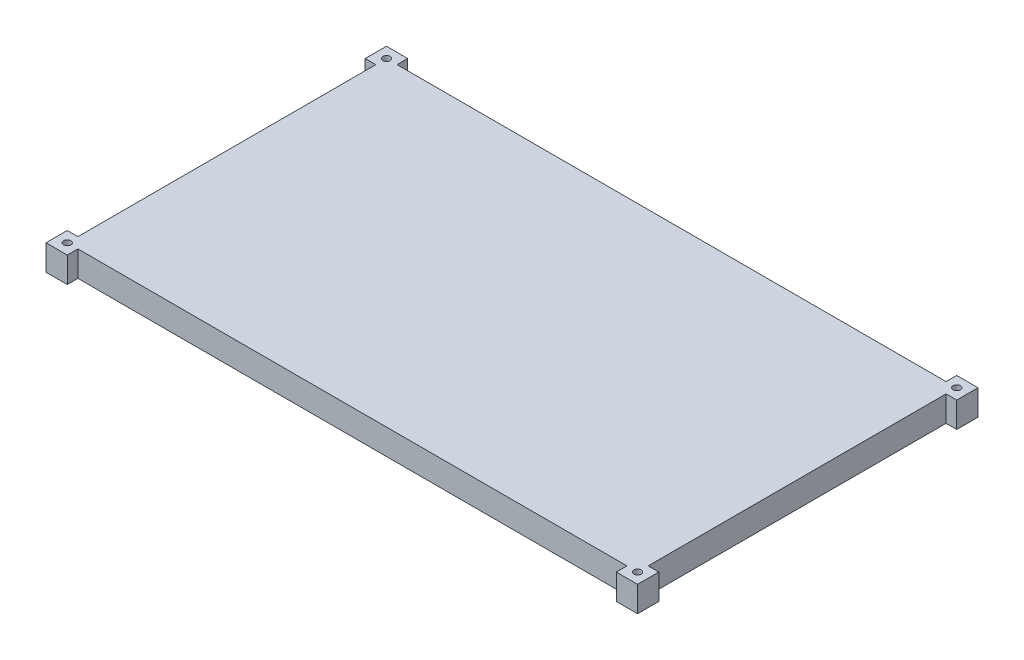
ISO-10303-21;
HEADER;
FILE_DESCRIPTION(('STEP AP214'),'2;1');
FILE_NAME('part.step','',(''),(''),'','','');
FILE_SCHEMA(('AUTOMOTIVE_DESIGN { 1 0 10303 214 1 1 1 1 }'));
ENDSEC;
DATA;
#1=APPLICATION_CONTEXT('core data for automotive mechanical design processes');
#2=APPLICATION_PROTOCOL_DEFINITION('international standard','automotive_design',2000,#1);
#3=PRODUCT_CONTEXT('',#1,'mechanical');
#4=PRODUCT('Part','Part','',(#3));
#5=PRODUCT_RELATED_PRODUCT_CATEGORY('part','',(#4));
#6=PRODUCT_DEFINITION_FORMATION('','',#4);
#7=PRODUCT_DEFINITION_CONTEXT('part definition',#1,'design');
#8=PRODUCT_DEFINITION('design','',#6,#7);
#9=PRODUCT_DEFINITION_SHAPE('','',#8);
#10=(LENGTH_UNIT() NAMED_UNIT(*) SI_UNIT(.MILLI.,.METRE.));
#11=(NAMED_UNIT(*) PLANE_ANGLE_UNIT() SI_UNIT($,.RADIAN.));
#12=(NAMED_UNIT(*) SI_UNIT($,.STERADIAN.) SOLID_ANGLE_UNIT());
#13=UNCERTAINTY_MEASURE_WITH_UNIT(LENGTH_MEASURE(1.E-05),#10,'distance_accuracy_value','');
#14=(GEOMETRIC_REPRESENTATION_CONTEXT(3) GLOBAL_UNCERTAINTY_ASSIGNED_CONTEXT((#13)) GLOBAL_UNIT_ASSIGNED_CONTEXT((#10,
#11,#12)) REPRESENTATION_CONTEXT('',''));
#15=CARTESIAN_POINT('',(0.,0.,0.));
#16=DIRECTION('',(0.,0.,1.));
#17=DIRECTION('',(1.,0.,0.));
#18=AXIS2_PLACEMENT_3D('',#15,#16,#17);
#19=CARTESIAN_POINT('',(85.09,7.62,47.625));
#20=DIRECTION('',(-1.,0.,0.));
#21=DIRECTION('',(0.,0.,1.));
#22=AXIS2_PLACEMENT_3D('',#19,#20,#21);
#23=PLANE('',#22);
#24=DIRECTION('',(0.,0.,-1.));
#25=VECTOR('',#24,1.);
#26=CARTESIAN_POINT('',(85.09,0.,47.625));
#27=LINE('',#26,#25);
#28=CARTESIAN_POINT('',(85.09,0.,44.45));
#29=VERTEX_POINT('',#28);
#30=CARTESIAN_POINT('',(85.09,0.,-44.45));
#31=VERTEX_POINT('',#30);
#32=EDGE_CURVE('E904',#29,#31,#27,.T.);
#33=ORIENTED_EDGE('',*,*,#32,.T.);
#34=DIRECTION('',(0.,1.,0.));
#35=VECTOR('',#34,1.);
#36=CARTESIAN_POINT('',(85.09,7.62,-44.45));
#37=LINE('',#36,#35);
#38=CARTESIAN_POINT('',(85.09,7.62,-44.45));
#39=VERTEX_POINT('',#38);
#40=EDGE_CURVE('E12',#31,#39,#37,.T.);
#41=ORIENTED_EDGE('',*,*,#40,.T.);
#42=DIRECTION('',(0.,0.,-1.));
#43=VECTOR('',#42,1.);
#44=CARTESIAN_POINT('',(85.09,7.62,47.625));
#45=LINE('',#44,#43);
#46=CARTESIAN_POINT('',(85.09,7.62,44.45));
#47=VERTEX_POINT('',#46);
#48=EDGE_CURVE('E908',#47,#39,#45,.T.);
#49=ORIENTED_EDGE('',*,*,#48,.F.);
#50=DIRECTION('',(0.,-1.,0.));
#51=VECTOR('',#50,1.);
#52=CARTESIAN_POINT('',(85.09,7.62,44.45));
#53=LINE('',#52,#51);
#54=EDGE_CURVE('E611',#47,#29,#53,.T.);
#55=ORIENTED_EDGE('',*,*,#54,.T.);
#56=EDGE_LOOP('',(#33,#41,#49,#55));
#57=FACE_BOUND('',#56,.T.);
#58=ADVANCED_FACE('F607',(#57),#23,.F.);
#59=CARTESIAN_POINT('',(-85.09,7.62,-47.625));
#60=DIRECTION('',(0.,0.,1.));
#61=DIRECTION('',(1.,0.,0.));
#62=AXIS2_PLACEMENT_3D('',#59,#60,#61);
#63=PLANE('',#62);
#64=DIRECTION('',(-1.,0.,0.));
#65=VECTOR('',#64,1.);
#66=CARTESIAN_POINT('',(-85.09,7.62,-47.625));
#67=LINE('',#66,#65);
#68=CARTESIAN_POINT('',(81.915,7.62,-47.625));
#69=VERTEX_POINT('',#68);
#70=CARTESIAN_POINT('',(-81.915,7.62,-47.625));
#71=VERTEX_POINT('',#70);
#72=EDGE_CURVE('E911',#69,#71,#67,.T.);
#73=ORIENTED_EDGE('',*,*,#72,.F.);
#74=DIRECTION('',(0.,-1.,0.));
#75=VECTOR('',#74,1.);
#76=CARTESIAN_POINT('',(81.915,7.62,-47.625));
#77=LINE('',#76,#75);
#78=CARTESIAN_POINT('',(81.915,0.,-47.625));
#79=VERTEX_POINT('',#78);
#80=EDGE_CURVE('E957',#69,#79,#77,.T.);
#81=ORIENTED_EDGE('',*,*,#80,.T.);
#82=DIRECTION('',(-1.,0.,0.));
#83=VECTOR('',#82,1.);
#84=CARTESIAN_POINT('',(-85.09,0.,-47.625));
#85=LINE('',#84,#83);
#86=CARTESIAN_POINT('',(-81.915,0.,-47.625));
#87=VERTEX_POINT('',#86);
#88=EDGE_CURVE('E927',#79,#87,#85,.T.);
#89=ORIENTED_EDGE('',*,*,#88,.T.);
#90=DIRECTION('',(0.,1.,0.));
#91=VECTOR('',#90,1.);
#92=CARTESIAN_POINT('',(-81.915,7.62,-47.625));
#93=LINE('',#92,#91);
#94=EDGE_CURVE('E954',#87,#71,#93,.T.);
#95=ORIENTED_EDGE('',*,*,#94,.T.);
#96=EDGE_LOOP('',(#73,#81,#89,#95));
#97=FACE_BOUND('',#96,.T.);
#98=ADVANCED_FACE('F1040',(#97),#63,.F.);
#99=CARTESIAN_POINT('',(-85.09,7.62,47.625));
#100=DIRECTION('',(1.,0.,0.));
#101=DIRECTION('',(0.,0.,-1.));
#102=AXIS2_PLACEMENT_3D('',#99,#100,#101);
#103=PLANE('',#102);
#104=DIRECTION('',(0.,0.,1.));
#105=VECTOR('',#104,1.);
#106=CARTESIAN_POINT('',(-85.09,0.,47.625));
#107=LINE('',#106,#105);
#108=CARTESIAN_POINT('',(-85.09,0.,-44.45));
#109=VERTEX_POINT('',#108);
#110=CARTESIAN_POINT('',(-85.09,0.,44.45));
#111=VERTEX_POINT('',#110);
#112=EDGE_CURVE('E932',#109,#111,#107,.T.);
#113=ORIENTED_EDGE('',*,*,#112,.T.);
#114=DIRECTION('',(0.,1.,0.));
#115=VECTOR('',#114,1.);
#116=CARTESIAN_POINT('',(-85.09,7.62,44.45));
#117=LINE('',#116,#115);
#118=CARTESIAN_POINT('',(-85.09,7.62,44.45));
#119=VERTEX_POINT('',#118);
#120=EDGE_CURVE('E949',#111,#119,#117,.T.);
#121=ORIENTED_EDGE('',*,*,#120,.T.);
#122=DIRECTION('',(0.,0.,1.));
#123=VECTOR('',#122,1.);
#124=CARTESIAN_POINT('',(-85.09,7.62,47.625));
#125=LINE('',#124,#123);
#126=CARTESIAN_POINT('',(-85.09,7.62,-44.45));
#127=VERTEX_POINT('',#126);
#128=EDGE_CURVE('E916',#127,#119,#125,.T.);
#129=ORIENTED_EDGE('',*,*,#128,.F.);
#130=DIRECTION('',(0.,-1.,0.));
#131=VECTOR('',#130,1.);
#132=CARTESIAN_POINT('',(-85.09,7.62,-44.45));
#133=LINE('',#132,#131);
#134=EDGE_CURVE('E950',#127,#109,#133,.T.);
#135=ORIENTED_EDGE('',*,*,#134,.T.);
#136=EDGE_LOOP('',(#113,#121,#129,#135));
#137=FACE_BOUND('',#136,.T.);
#138=ADVANCED_FACE('F1019',(#137),#103,.F.);
#139=CARTESIAN_POINT('',(-85.09,7.62,47.625));
#140=DIRECTION('',(0.,0.,-1.));
#141=DIRECTION('',(-1.,0.,0.));
#142=AXIS2_PLACEMENT_3D('',#139,#140,#141);
#143=PLANE('',#142);
#144=DIRECTION('',(1.,0.,0.));
#145=VECTOR('',#144,1.);
#146=CARTESIAN_POINT('',(-85.09,7.62,47.625));
#147=LINE('',#146,#145);
#148=CARTESIAN_POINT('',(-81.915,7.62,47.625));
#149=VERTEX_POINT('',#148);
#150=CARTESIAN_POINT('',(81.915,7.62,47.625));
#151=VERTEX_POINT('',#150);
#152=EDGE_CURVE('E925',#149,#151,#147,.T.);
#153=ORIENTED_EDGE('',*,*,#152,.F.);
#154=DIRECTION('',(0.,-1.,0.));
#155=VECTOR('',#154,1.);
#156=CARTESIAN_POINT('',(-81.915,7.62,47.625));
#157=LINE('',#156,#155);
#158=CARTESIAN_POINT('',(-81.915,0.,47.625));
#159=VERTEX_POINT('',#158);
#160=EDGE_CURVE('E942',#149,#159,#157,.T.);
#161=ORIENTED_EDGE('',*,*,#160,.T.);
#162=DIRECTION('',(1.,0.,0.));
#163=VECTOR('',#162,1.);
#164=CARTESIAN_POINT('',(-85.09,0.,47.625));
#165=LINE('',#164,#163);
#166=CARTESIAN_POINT('',(81.915,0.,47.625));
#167=VERTEX_POINT('',#166);
#168=EDGE_CURVE('E915',#159,#167,#165,.T.);
#169=ORIENTED_EDGE('',*,*,#168,.T.);
#170=DIRECTION('',(0.,1.,0.));
#171=VECTOR('',#170,1.);
#172=CARTESIAN_POINT('',(81.915,7.62,47.625));
#173=LINE('',#172,#171);
#174=EDGE_CURVE('E924',#167,#151,#173,.T.);
#175=ORIENTED_EDGE('',*,*,#174,.T.);
#176=EDGE_LOOP('',(#153,#161,#169,#175));
#177=FACE_BOUND('',#176,.T.);
#178=ADVANCED_FACE('F1005',(#177),#143,.F.);
#179=CARTESIAN_POINT('',(0.,7.62,0.));
#180=DIRECTION('',(0.,-1.,0.));
#181=DIRECTION('',(0.,0.,-1.));
#182=AXIS2_PLACEMENT_3D('',#179,#180,#181);
#183=PLANE('',#182);
#184=CARTESIAN_POINT('',(85.09,7.62,-47.625));
#185=DIRECTION('',(0.,1.,0.));
#186=DIRECTION('',(0.,0.,1.));
#187=AXIS2_PLACEMENT_3D('',#184,#185,#186);
#188=CIRCLE('',#187,1.0922);
#189=CARTESIAN_POINT('',(85.09,7.62,-46.5328));
#190=VERTEX_POINT('',#189);
#191=EDGE_CURVE('E1068',#190,#190,#188,.T.);
#192=ORIENTED_EDGE('',*,*,#191,.F.);
#193=EDGE_LOOP('',(#192));
#194=FACE_BOUND('',#193,.T.);
#195=CARTESIAN_POINT('',(85.09,7.62,47.625));
#196=DIRECTION('',(0.,1.,0.));
#197=DIRECTION('',(0.,0.,1.));
#198=AXIS2_PLACEMENT_3D('',#195,#196,#197);
#199=CIRCLE('',#198,1.0922);
#200=CARTESIAN_POINT('',(85.09,7.62,48.7172));
#201=VERTEX_POINT('',#200);
#202=EDGE_CURVE('E1066',#201,#201,#199,.T.);
#203=ORIENTED_EDGE('',*,*,#202,.F.);
#204=EDGE_LOOP('',(#203));
#205=FACE_BOUND('',#204,.T.);
#206=CARTESIAN_POINT('',(-85.09,7.62,47.625));
#207=DIRECTION('',(0.,1.,0.));
#208=DIRECTION('',(0.,0.,1.));
#209=AXIS2_PLACEMENT_3D('',#206,#207,#208);
#210=CIRCLE('',#209,1.0922);
#211=CARTESIAN_POINT('',(-85.09,7.62,48.7172));
#212=VERTEX_POINT('',#211);
#213=EDGE_CURVE('E1063',#212,#212,#210,.T.);
#214=ORIENTED_EDGE('',*,*,#213,.F.);
#215=EDGE_LOOP('',(#214));
#216=FACE_BOUND('',#215,.T.);
#217=CARTESIAN_POINT('',(-85.09,7.62,-47.625));
#218=DIRECTION('',(0.,1.,0.));
#219=DIRECTION('',(0.,0.,1.));
#220=AXIS2_PLACEMENT_3D('',#217,#218,#219);
#221=CIRCLE('',#220,1.0922);
#222=CARTESIAN_POINT('',(-85.09,7.62,-46.5328));
#223=VERTEX_POINT('',#222);
#224=EDGE_CURVE('E970',#223,#223,#221,.T.);
#225=ORIENTED_EDGE('',*,*,#224,.F.);
#226=EDGE_LOOP('',(#225));
#227=FACE_BOUND('',#226,.T.);
#228=DIRECTION('',(-1.,0.,0.));
#229=VECTOR('',#228,1.);
#230=CARTESIAN_POINT('',(81.915,7.62,44.45));
#231=LINE('',#230,#229);
#232=CARTESIAN_POINT('',(88.265,7.62,44.45));
#233=VERTEX_POINT('',#232);
#234=EDGE_CURVE('E767',#233,#47,#231,.T.);
#235=ORIENTED_EDGE('',*,*,#234,.T.);
#236=ORIENTED_EDGE('',*,*,#48,.T.);
#237=DIRECTION('',(1.,0.,0.));
#238=VECTOR('',#237,1.);
#239=CARTESIAN_POINT('',(81.915,7.62,-44.45));
#240=LINE('',#239,#238);
#241=CARTESIAN_POINT('',(88.265,7.62,-44.45));
#242=VERTEX_POINT('',#241);
#243=EDGE_CURVE('E843',#39,#242,#240,.T.);
#244=ORIENTED_EDGE('',*,*,#243,.T.);
#245=DIRECTION('',(0.,0.,-1.));
#246=VECTOR('',#245,1.);
#247=CARTESIAN_POINT('',(88.265,7.62,-44.45));
#248=LINE('',#247,#246);
#249=CARTESIAN_POINT('',(88.265,7.62,-50.8));
#250=VERTEX_POINT('',#249);
#251=EDGE_CURVE('E804',#242,#250,#248,.T.);
#252=ORIENTED_EDGE('',*,*,#251,.T.);
#253=DIRECTION('',(-1.,0.,0.));
#254=VECTOR('',#253,1.);
#255=CARTESIAN_POINT('',(81.915,7.62,-50.8));
#256=LINE('',#255,#254);
#257=CARTESIAN_POINT('',(81.915,7.62,-50.8));
#258=VERTEX_POINT('',#257);
#259=EDGE_CURVE('E852',#250,#258,#256,.T.);
#260=ORIENTED_EDGE('',*,*,#259,.T.);
#261=DIRECTION('',(0.,0.,1.));
#262=VECTOR('',#261,1.);
#263=CARTESIAN_POINT('',(81.915,7.62,-44.45));
#264=LINE('',#263,#262);
#265=EDGE_CURVE('E847',#258,#69,#264,.T.);
#266=ORIENTED_EDGE('',*,*,#265,.T.);
#267=ORIENTED_EDGE('',*,*,#72,.T.);
#268=DIRECTION('',(0.,0.,-1.));
#269=VECTOR('',#268,1.);
#270=CARTESIAN_POINT('',(-81.915,7.62,-44.45));
#271=LINE('',#270,#269);
#272=CARTESIAN_POINT('',(-81.915,7.62,-50.8));
#273=VERTEX_POINT('',#272);
#274=EDGE_CURVE('E825',#71,#273,#271,.T.);
#275=ORIENTED_EDGE('',*,*,#274,.T.);
#276=DIRECTION('',(-1.,0.,0.));
#277=VECTOR('',#276,1.);
#278=CARTESIAN_POINT('',(-88.265,7.62,-50.8));
#279=LINE('',#278,#277);
#280=CARTESIAN_POINT('',(-88.265,7.62,-50.8));
#281=VERTEX_POINT('',#280);
#282=EDGE_CURVE('E887',#273,#281,#279,.T.);
#283=ORIENTED_EDGE('',*,*,#282,.T.);
#284=DIRECTION('',(0.,0.,1.));
#285=VECTOR('',#284,1.);
#286=CARTESIAN_POINT('',(-88.265,7.62,-44.45));
#287=LINE('',#286,#285);
#288=CARTESIAN_POINT('',(-88.265,7.62,-44.45));
#289=VERTEX_POINT('',#288);
#290=EDGE_CURVE('E895',#281,#289,#287,.T.);
#291=ORIENTED_EDGE('',*,*,#290,.T.);
#292=DIRECTION('',(1.,0.,0.));
#293=VECTOR('',#292,1.);
#294=CARTESIAN_POINT('',(-88.265,7.62,-44.45));
#295=LINE('',#294,#293);
#296=EDGE_CURVE('E874',#289,#127,#295,.T.);
#297=ORIENTED_EDGE('',*,*,#296,.T.);
#298=ORIENTED_EDGE('',*,*,#128,.T.);
#299=DIRECTION('',(-1.,0.,0.));
#300=VECTOR('',#299,1.);
#301=CARTESIAN_POINT('',(-88.265,7.62,44.45));
#302=LINE('',#301,#300);
#303=CARTESIAN_POINT('',(-88.265,7.62,44.45));
#304=VERTEX_POINT('',#303);
#305=EDGE_CURVE('E814',#119,#304,#302,.T.);
#306=ORIENTED_EDGE('',*,*,#305,.T.);
#307=DIRECTION('',(0.,0.,1.));
#308=VECTOR('',#307,1.);
#309=CARTESIAN_POINT('',(-88.265,7.62,50.8));
#310=LINE('',#309,#308);
#311=CARTESIAN_POINT('',(-88.265,7.62,50.8));
#312=VERTEX_POINT('',#311);
#313=EDGE_CURVE('E807',#304,#312,#310,.T.);
#314=ORIENTED_EDGE('',*,*,#313,.T.);
#315=DIRECTION('',(1.,0.,0.));
#316=VECTOR('',#315,1.);
#317=CARTESIAN_POINT('',(-88.265,7.62,50.8));
#318=LINE('',#317,#316);
#319=CARTESIAN_POINT('',(-81.915,7.62,50.8));
#320=VERTEX_POINT('',#319);
#321=EDGE_CURVE('E808',#312,#320,#318,.T.);
#322=ORIENTED_EDGE('',*,*,#321,.T.);
#323=DIRECTION('',(0.,0.,-1.));
#324=VECTOR('',#323,1.);
#325=CARTESIAN_POINT('',(-81.915,7.62,50.8));
#326=LINE('',#325,#324);
#327=EDGE_CURVE('E818',#320,#149,#326,.T.);
#328=ORIENTED_EDGE('',*,*,#327,.T.);
#329=ORIENTED_EDGE('',*,*,#152,.T.);
#330=DIRECTION('',(0.,0.,1.));
#331=VECTOR('',#330,1.);
#332=CARTESIAN_POINT('',(81.915,7.62,50.8));
#333=LINE('',#332,#331);
#334=CARTESIAN_POINT('',(81.915,7.62,50.8));
#335=VERTEX_POINT('',#334);
#336=EDGE_CURVE('E775',#151,#335,#333,.T.);
#337=ORIENTED_EDGE('',*,*,#336,.T.);
#338=DIRECTION('',(1.,0.,0.));
#339=VECTOR('',#338,1.);
#340=CARTESIAN_POINT('',(81.915,7.62,50.8));
#341=LINE('',#340,#339);
#342=CARTESIAN_POINT('',(88.265,7.62,50.8));
#343=VERTEX_POINT('',#342);
#344=EDGE_CURVE('E749',#335,#343,#341,.T.);
#345=ORIENTED_EDGE('',*,*,#344,.T.);
#346=DIRECTION('',(0.,0.,-1.));
#347=VECTOR('',#346,1.);
#348=CARTESIAN_POINT('',(88.265,7.62,50.8));
#349=LINE('',#348,#347);
#350=EDGE_CURVE('E759',#343,#233,#349,.T.);
#351=ORIENTED_EDGE('',*,*,#350,.T.);
#352=EDGE_LOOP('',(#235,#236,#244,#252,#260,#266,#267,#275,#283,#291,#297,#298,#306,#314,#322,
#328,#329,#337,#345,#351));
#353=FACE_BOUND('',#352,.T.);
#354=ADVANCED_FACE('F769',(#194,#205,#216,#227,#353),#183,.F.);
#355=CARTESIAN_POINT('',(0.,0.,0.));
#356=DIRECTION('',(0.,-1.,0.));
#357=DIRECTION('',(0.,0.,-1.));
#358=AXIS2_PLACEMENT_3D('',#355,#356,#357);
#359=PLANE('',#358);
#360=CARTESIAN_POINT('',(85.09,0.,-47.625));
#361=DIRECTION('',(0.,-1.,0.));
#362=DIRECTION('',(0.,0.,-1.));
#363=AXIS2_PLACEMENT_3D('',#360,#361,#362);
#364=CIRCLE('',#363,1.0922);
#365=CARTESIAN_POINT('',(85.09,0.,-48.7172));
#366=VERTEX_POINT('',#365);
#367=EDGE_CURVE('E606',#366,#366,#364,.T.);
#368=ORIENTED_EDGE('',*,*,#367,.F.);
#369=EDGE_LOOP('',(#368));
#370=FACE_BOUND('',#369,.T.);
#371=CARTESIAN_POINT('',(85.09,0.,47.625));
#372=DIRECTION('',(0.,-1.,0.));
#373=DIRECTION('',(0.,0.,-1.));
#374=AXIS2_PLACEMENT_3D('',#371,#372,#373);
#375=CIRCLE('',#374,1.0922);
#376=CARTESIAN_POINT('',(85.09,0.,46.5328));
#377=VERTEX_POINT('',#376);
#378=EDGE_CURVE('E975',#377,#377,#375,.T.);
#379=ORIENTED_EDGE('',*,*,#378,.F.);
#380=EDGE_LOOP('',(#379));
#381=FACE_BOUND('',#380,.T.);
#382=CARTESIAN_POINT('',(-85.09,0.,47.625));
#383=DIRECTION('',(0.,-1.,0.));
#384=DIRECTION('',(0.,0.,-1.));
#385=AXIS2_PLACEMENT_3D('',#382,#383,#384);
#386=CIRCLE('',#385,1.0922);
#387=CARTESIAN_POINT('',(-85.09,0.,46.5328));
#388=VERTEX_POINT('',#387);
#389=EDGE_CURVE('E966',#388,#388,#386,.T.);
#390=ORIENTED_EDGE('',*,*,#389,.F.);
#391=EDGE_LOOP('',(#390));
#392=FACE_BOUND('',#391,.T.);
#393=CARTESIAN_POINT('',(-85.09,0.,-47.625));
#394=DIRECTION('',(0.,-1.,0.));
#395=DIRECTION('',(0.,0.,-1.));
#396=AXIS2_PLACEMENT_3D('',#393,#394,#395);
#397=CIRCLE('',#396,1.0922);
#398=CARTESIAN_POINT('',(-85.09,0.,-48.7172));
#399=VERTEX_POINT('',#398);
#400=EDGE_CURVE('E963',#399,#399,#397,.T.);
#401=ORIENTED_EDGE('',*,*,#400,.F.);
#402=EDGE_LOOP('',(#401));
#403=FACE_BOUND('',#402,.T.);
#404=ORIENTED_EDGE('',*,*,#168,.F.);
#405=DIRECTION('',(0.,0.,-1.));
#406=VECTOR('',#405,1.);
#407=CARTESIAN_POINT('',(-81.915,0.,50.8));
#408=LINE('',#407,#406);
#409=CARTESIAN_POINT('',(-81.915,0.,50.8));
#410=VERTEX_POINT('',#409);
#411=EDGE_CURVE('E811',#410,#159,#408,.T.);
#412=ORIENTED_EDGE('',*,*,#411,.F.);
#413=DIRECTION('',(1.,0.,0.));
#414=VECTOR('',#413,1.);
#415=CARTESIAN_POINT('',(-88.265,0.,50.8));
#416=LINE('',#415,#414);
#417=CARTESIAN_POINT('',(-88.265,0.,50.8));
#418=VERTEX_POINT('',#417);
#419=EDGE_CURVE('E797',#418,#410,#416,.T.);
#420=ORIENTED_EDGE('',*,*,#419,.F.);
#421=DIRECTION('',(0.,0.,1.));
#422=VECTOR('',#421,1.);
#423=CARTESIAN_POINT('',(-88.265,0.,50.8));
#424=LINE('',#423,#422);
#425=CARTESIAN_POINT('',(-88.265,0.,44.45));
#426=VERTEX_POINT('',#425);
#427=EDGE_CURVE('E827',#426,#418,#424,.T.);
#428=ORIENTED_EDGE('',*,*,#427,.F.);
#429=DIRECTION('',(-1.,0.,0.));
#430=VECTOR('',#429,1.);
#431=CARTESIAN_POINT('',(-88.265,0.,44.45));
#432=LINE('',#431,#430);
#433=EDGE_CURVE('E828',#111,#426,#432,.T.);
#434=ORIENTED_EDGE('',*,*,#433,.F.);
#435=ORIENTED_EDGE('',*,*,#112,.F.);
#436=DIRECTION('',(1.,0.,0.));
#437=VECTOR('',#436,1.);
#438=CARTESIAN_POINT('',(-88.265,0.,-44.45));
#439=LINE('',#438,#437);
#440=CARTESIAN_POINT('',(-88.265,0.,-44.45));
#441=VERTEX_POINT('',#440);
#442=EDGE_CURVE('E631',#441,#109,#439,.T.);
#443=ORIENTED_EDGE('',*,*,#442,.F.);
#444=DIRECTION('',(0.,0.,1.));
#445=VECTOR('',#444,1.);
#446=CARTESIAN_POINT('',(-88.265,0.,-44.45));
#447=LINE('',#446,#445);
#448=CARTESIAN_POINT('',(-88.265,0.,-50.8));
#449=VERTEX_POINT('',#448);
#450=EDGE_CURVE('E878',#449,#441,#447,.T.);
#451=ORIENTED_EDGE('',*,*,#450,.F.);
#452=DIRECTION('',(-1.,0.,0.));
#453=VECTOR('',#452,1.);
#454=CARTESIAN_POINT('',(-88.265,0.,-50.8));
#455=LINE('',#454,#453);
#456=CARTESIAN_POINT('',(-81.915,0.,-50.8));
#457=VERTEX_POINT('',#456);
#458=EDGE_CURVE('E872',#457,#449,#455,.T.);
#459=ORIENTED_EDGE('',*,*,#458,.F.);
#460=DIRECTION('',(0.,0.,-1.));
#461=VECTOR('',#460,1.);
#462=CARTESIAN_POINT('',(-81.915,0.,-44.45));
#463=LINE('',#462,#461);
#464=EDGE_CURVE('E871',#87,#457,#463,.T.);
#465=ORIENTED_EDGE('',*,*,#464,.F.);
#466=ORIENTED_EDGE('',*,*,#88,.F.);
#467=DIRECTION('',(0.,0.,1.));
#468=VECTOR('',#467,1.);
#469=CARTESIAN_POINT('',(81.915,0.,-44.45));
#470=LINE('',#469,#468);
#471=CARTESIAN_POINT('',(81.915,0.,-50.8));
#472=VERTEX_POINT('',#471);
#473=EDGE_CURVE('E621',#472,#79,#470,.T.);
#474=ORIENTED_EDGE('',*,*,#473,.F.);
#475=DIRECTION('',(-1.,0.,0.));
#476=VECTOR('',#475,1.);
#477=CARTESIAN_POINT('',(81.915,0.,-50.8));
#478=LINE('',#477,#476);
#479=CARTESIAN_POINT('',(88.265,0.,-50.8));
#480=VERTEX_POINT('',#479);
#481=EDGE_CURVE('E864',#480,#472,#478,.T.);
#482=ORIENTED_EDGE('',*,*,#481,.F.);
#483=DIRECTION('',(0.,0.,-1.));
#484=VECTOR('',#483,1.);
#485=CARTESIAN_POINT('',(88.265,0.,-44.45));
#486=LINE('',#485,#484);
#487=CARTESIAN_POINT('',(88.265,0.,-44.45));
#488=VERTEX_POINT('',#487);
#489=EDGE_CURVE('E850',#488,#480,#486,.T.);
#490=ORIENTED_EDGE('',*,*,#489,.F.);
#491=DIRECTION('',(1.,0.,0.));
#492=VECTOR('',#491,1.);
#493=CARTESIAN_POINT('',(81.915,0.,-44.45));
#494=LINE('',#493,#492);
#495=EDGE_CURVE('E837',#31,#488,#494,.T.);
#496=ORIENTED_EDGE('',*,*,#495,.F.);
#497=ORIENTED_EDGE('',*,*,#32,.F.);
#498=DIRECTION('',(-1.,0.,0.));
#499=VECTOR('',#498,1.);
#500=CARTESIAN_POINT('',(81.915,0.,44.45));
#501=LINE('',#500,#499);
#502=CARTESIAN_POINT('',(88.265,0.,44.45));
#503=VERTEX_POINT('',#502);
#504=EDGE_CURVE('E781',#503,#29,#501,.T.);
#505=ORIENTED_EDGE('',*,*,#504,.F.);
#506=DIRECTION('',(0.,0.,-1.));
#507=VECTOR('',#506,1.);
#508=CARTESIAN_POINT('',(88.265,0.,50.8));
#509=LINE('',#508,#507);
#510=CARTESIAN_POINT('',(88.265,0.,50.8));
#511=VERTEX_POINT('',#510);
#512=EDGE_CURVE('E773',#511,#503,#509,.T.);
#513=ORIENTED_EDGE('',*,*,#512,.F.);
#514=DIRECTION('',(1.,0.,0.));
#515=VECTOR('',#514,1.);
#516=CARTESIAN_POINT('',(81.915,0.,50.8));
#517=LINE('',#516,#515);
#518=CARTESIAN_POINT('',(81.915,0.,50.8));
#519=VERTEX_POINT('',#518);
#520=EDGE_CURVE('E755',#519,#511,#517,.T.);
#521=ORIENTED_EDGE('',*,*,#520,.F.);
#522=DIRECTION('',(0.,0.,1.));
#523=VECTOR('',#522,1.);
#524=CARTESIAN_POINT('',(81.915,0.,50.8));
#525=LINE('',#524,#523);
#526=EDGE_CURVE('E789',#167,#519,#525,.T.);
#527=ORIENTED_EDGE('',*,*,#526,.F.);
#528=EDGE_LOOP('',(#404,#412,#420,#428,#434,#435,#443,#451,#459,#465,#466,#474,#482,#490,#496,
#497,#505,#513,#521,#527));
#529=FACE_BOUND('',#528,.T.);
#530=ADVANCED_FACE('F986',(#370,#381,#392,#403,#529),#359,.T.);
#531=CARTESIAN_POINT('',(81.915,0.,44.45));
#532=DIRECTION('',(0.,0.,-1.));
#533=DIRECTION('',(-1.,0.,0.));
#534=AXIS2_PLACEMENT_3D('',#531,#532,#533);
#535=PLANE('',#534);
#536=ORIENTED_EDGE('',*,*,#54,.F.);
#537=ORIENTED_EDGE('',*,*,#234,.F.);
#538=DIRECTION('',(0.,1.,0.));
#539=VECTOR('',#538,1.);
#540=CARTESIAN_POINT('',(88.265,0.,44.45));
#541=LINE('',#540,#539);
#542=EDGE_CURVE('E765',#503,#233,#541,.T.);
#543=ORIENTED_EDGE('',*,*,#542,.F.);
#544=ORIENTED_EDGE('',*,*,#504,.T.);
#545=EDGE_LOOP('',(#536,#537,#543,#544));
#546=FACE_BOUND('',#545,.T.);
#547=ADVANCED_FACE('F988',(#546),#535,.T.);
#548=CARTESIAN_POINT('',(81.915,0.,50.8));
#549=DIRECTION('',(-1.,0.,0.));
#550=DIRECTION('',(0.,0.,1.));
#551=AXIS2_PLACEMENT_3D('',#548,#549,#550);
#552=PLANE('',#551);
#553=ORIENTED_EDGE('',*,*,#174,.F.);
#554=ORIENTED_EDGE('',*,*,#526,.T.);
#555=DIRECTION('',(0.,1.,0.));
#556=VECTOR('',#555,1.);
#557=CARTESIAN_POINT('',(81.915,0.,50.8));
#558=LINE('',#557,#556);
#559=EDGE_CURVE('E760',#519,#335,#558,.T.);
#560=ORIENTED_EDGE('',*,*,#559,.T.);
#561=ORIENTED_EDGE('',*,*,#336,.F.);
#562=EDGE_LOOP('',(#553,#554,#560,#561));
#563=FACE_BOUND('',#562,.T.);
#564=ADVANCED_FACE('F1140',(#563),#552,.T.);
#565=CARTESIAN_POINT('',(88.265,0.,50.8));
#566=DIRECTION('',(1.,0.,0.));
#567=DIRECTION('',(0.,0.,-1.));
#568=AXIS2_PLACEMENT_3D('',#565,#566,#567);
#569=PLANE('',#568);
#570=ORIENTED_EDGE('',*,*,#350,.F.);
#571=DIRECTION('',(0.,1.,0.));
#572=VECTOR('',#571,1.);
#573=CARTESIAN_POINT('',(88.265,0.,50.8));
#574=LINE('',#573,#572);
#575=EDGE_CURVE('E744',#511,#343,#574,.T.);
#576=ORIENTED_EDGE('',*,*,#575,.F.);
#577=ORIENTED_EDGE('',*,*,#512,.T.);
#578=ORIENTED_EDGE('',*,*,#542,.T.);
#579=EDGE_LOOP('',(#570,#576,#577,#578));
#580=FACE_BOUND('',#579,.T.);
#581=ADVANCED_FACE('F761',(#580),#569,.T.);
#582=CARTESIAN_POINT('',(81.915,0.,50.8));
#583=DIRECTION('',(0.,0.,1.));
#584=DIRECTION('',(1.,0.,0.));
#585=AXIS2_PLACEMENT_3D('',#582,#583,#584);
#586=PLANE('',#585);
#587=ORIENTED_EDGE('',*,*,#344,.F.);
#588=ORIENTED_EDGE('',*,*,#559,.F.);
#589=ORIENTED_EDGE('',*,*,#520,.T.);
#590=ORIENTED_EDGE('',*,*,#575,.T.);
#591=EDGE_LOOP('',(#587,#588,#589,#590));
#592=FACE_BOUND('',#591,.T.);
#593=ADVANCED_FACE('F747',(#592),#586,.T.);
#594=CARTESIAN_POINT('',(-88.265,0.,44.45));
#595=DIRECTION('',(0.,0.,-1.));
#596=DIRECTION('',(-1.,0.,0.));
#597=AXIS2_PLACEMENT_3D('',#594,#595,#596);
#598=PLANE('',#597);
#599=ORIENTED_EDGE('',*,*,#120,.F.);
#600=ORIENTED_EDGE('',*,*,#433,.T.);
#601=DIRECTION('',(0.,1.,0.));
#602=VECTOR('',#601,1.);
#603=CARTESIAN_POINT('',(-88.265,0.,44.45));
#604=LINE('',#603,#602);
#605=EDGE_CURVE('E795',#426,#304,#604,.T.);
#606=ORIENTED_EDGE('',*,*,#605,.T.);
#607=ORIENTED_EDGE('',*,*,#305,.F.);
#608=EDGE_LOOP('',(#599,#600,#606,#607));
#609=FACE_BOUND('',#608,.T.);
#610=ADVANCED_FACE('F1020',(#609),#598,.T.);
#611=CARTESIAN_POINT('',(-81.915,0.,50.8));
#612=DIRECTION('',(1.,0.,0.));
#613=DIRECTION('',(0.,0.,-1.));
#614=AXIS2_PLACEMENT_3D('',#611,#612,#613);
#615=PLANE('',#614);
#616=ORIENTED_EDGE('',*,*,#160,.F.);
#617=ORIENTED_EDGE('',*,*,#327,.F.);
#618=DIRECTION('',(0.,1.,0.));
#619=VECTOR('',#618,1.);
#620=CARTESIAN_POINT('',(-81.915,0.,50.8));
#621=LINE('',#620,#619);
#622=EDGE_CURVE('E802',#410,#320,#621,.T.);
#623=ORIENTED_EDGE('',*,*,#622,.F.);
#624=ORIENTED_EDGE('',*,*,#411,.T.);
#625=EDGE_LOOP('',(#616,#617,#623,#624));
#626=FACE_BOUND('',#625,.T.);
#627=ADVANCED_FACE('F1004',(#626),#615,.T.);
#628=CARTESIAN_POINT('',(-88.265,0.,50.8));
#629=DIRECTION('',(0.,0.,1.));
#630=DIRECTION('',(1.,0.,0.));
#631=AXIS2_PLACEMENT_3D('',#628,#629,#630);
#632=PLANE('',#631);
#633=ORIENTED_EDGE('',*,*,#321,.F.);
#634=DIRECTION('',(0.,1.,0.));
#635=VECTOR('',#634,1.);
#636=CARTESIAN_POINT('',(-88.265,0.,50.8));
#637=LINE('',#636,#635);
#638=EDGE_CURVE('E798',#418,#312,#637,.T.);
#639=ORIENTED_EDGE('',*,*,#638,.F.);
#640=ORIENTED_EDGE('',*,*,#419,.T.);
#641=ORIENTED_EDGE('',*,*,#622,.T.);
#642=EDGE_LOOP('',(#633,#639,#640,#641));
#643=FACE_BOUND('',#642,.T.);
#644=ADVANCED_FACE('F1009',(#643),#632,.T.);
#645=CARTESIAN_POINT('',(-88.265,0.,50.8));
#646=DIRECTION('',(-1.,0.,0.));
#647=DIRECTION('',(0.,0.,1.));
#648=AXIS2_PLACEMENT_3D('',#645,#646,#647);
#649=PLANE('',#648);
#650=ORIENTED_EDGE('',*,*,#313,.F.);
#651=ORIENTED_EDGE('',*,*,#605,.F.);
#652=ORIENTED_EDGE('',*,*,#427,.T.);
#653=ORIENTED_EDGE('',*,*,#638,.T.);
#654=EDGE_LOOP('',(#650,#651,#652,#653));
#655=FACE_BOUND('',#654,.T.);
#656=ADVANCED_FACE('F1011',(#655),#649,.T.);
#657=CARTESIAN_POINT('',(-81.915,0.,-44.45));
#658=DIRECTION('',(1.,0.,0.));
#659=DIRECTION('',(0.,0.,-1.));
#660=AXIS2_PLACEMENT_3D('',#657,#658,#659);
#661=PLANE('',#660);
#662=ORIENTED_EDGE('',*,*,#94,.F.);
#663=ORIENTED_EDGE('',*,*,#464,.T.);
#664=DIRECTION('',(0.,1.,0.));
#665=VECTOR('',#664,1.);
#666=CARTESIAN_POINT('',(-81.915,0.,-50.8));
#667=LINE('',#666,#665);
#668=EDGE_CURVE('E883',#457,#273,#667,.T.);
#669=ORIENTED_EDGE('',*,*,#668,.T.);
#670=ORIENTED_EDGE('',*,*,#274,.F.);
#671=EDGE_LOOP('',(#662,#663,#669,#670));
#672=FACE_BOUND('',#671,.T.);
#673=ADVANCED_FACE('F1033',(#672),#661,.T.);
#674=CARTESIAN_POINT('',(-88.265,0.,-44.45));
#675=DIRECTION('',(0.,0.,1.));
#676=DIRECTION('',(1.,0.,0.));
#677=AXIS2_PLACEMENT_3D('',#674,#675,#676);
#678=PLANE('',#677);
#679=ORIENTED_EDGE('',*,*,#134,.F.);
#680=ORIENTED_EDGE('',*,*,#296,.F.);
#681=DIRECTION('',(0.,1.,0.));
#682=VECTOR('',#681,1.);
#683=CARTESIAN_POINT('',(-88.265,0.,-44.45));
#684=LINE('',#683,#682);
#685=EDGE_CURVE('E899',#441,#289,#684,.T.);
#686=ORIENTED_EDGE('',*,*,#685,.F.);
#687=ORIENTED_EDGE('',*,*,#442,.T.);
#688=EDGE_LOOP('',(#679,#680,#686,#687));
#689=FACE_BOUND('',#688,.T.);
#690=ADVANCED_FACE('F1021',(#689),#678,.T.);
#691=CARTESIAN_POINT('',(-88.265,0.,-44.45));
#692=DIRECTION('',(-1.,0.,0.));
#693=DIRECTION('',(0.,0.,1.));
#694=AXIS2_PLACEMENT_3D('',#691,#692,#693);
#695=PLANE('',#694);
#696=ORIENTED_EDGE('',*,*,#290,.F.);
#697=DIRECTION('',(0.,1.,0.));
#698=VECTOR('',#697,1.);
#699=CARTESIAN_POINT('',(-88.265,0.,-50.8));
#700=LINE('',#699,#698);
#701=EDGE_CURVE('E902',#449,#281,#700,.T.);
#702=ORIENTED_EDGE('',*,*,#701,.F.);
#703=ORIENTED_EDGE('',*,*,#450,.T.);
#704=ORIENTED_EDGE('',*,*,#685,.T.);
#705=EDGE_LOOP('',(#696,#702,#703,#704));
#706=FACE_BOUND('',#705,.T.);
#707=ADVANCED_FACE('F1117',(#706),#695,.T.);
#708=CARTESIAN_POINT('',(-88.265,0.,-50.8));
#709=DIRECTION('',(0.,0.,-1.));
#710=DIRECTION('',(-1.,0.,0.));
#711=AXIS2_PLACEMENT_3D('',#708,#709,#710);
#712=PLANE('',#711);
#713=ORIENTED_EDGE('',*,*,#282,.F.);
#714=ORIENTED_EDGE('',*,*,#668,.F.);
#715=ORIENTED_EDGE('',*,*,#458,.T.);
#716=ORIENTED_EDGE('',*,*,#701,.T.);
#717=EDGE_LOOP('',(#713,#714,#715,#716));
#718=FACE_BOUND('',#717,.T.);
#719=ADVANCED_FACE('F1031',(#718),#712,.T.);
#720=CARTESIAN_POINT('',(81.915,0.,-44.45));
#721=DIRECTION('',(0.,0.,1.));
#722=DIRECTION('',(1.,0.,0.));
#723=AXIS2_PLACEMENT_3D('',#720,#721,#722);
#724=PLANE('',#723);
#725=ORIENTED_EDGE('',*,*,#40,.F.);
#726=ORIENTED_EDGE('',*,*,#495,.T.);
#727=DIRECTION('',(0.,1.,0.));
#728=VECTOR('',#727,1.);
#729=CARTESIAN_POINT('',(88.265,0.,-44.45));
#730=LINE('',#729,#728);
#731=EDGE_CURVE('E770',#488,#242,#730,.T.);
#732=ORIENTED_EDGE('',*,*,#731,.T.);
#733=ORIENTED_EDGE('',*,*,#243,.F.);
#734=EDGE_LOOP('',(#725,#726,#732,#733));
#735=FACE_BOUND('',#734,.T.);
#736=ADVANCED_FACE('F1053',(#735),#724,.T.);
#737=CARTESIAN_POINT('',(81.915,0.,-44.45));
#738=DIRECTION('',(-1.,0.,0.));
#739=DIRECTION('',(0.,0.,1.));
#740=AXIS2_PLACEMENT_3D('',#737,#738,#739);
#741=PLANE('',#740);
#742=ORIENTED_EDGE('',*,*,#80,.F.);
#743=ORIENTED_EDGE('',*,*,#265,.F.);
#744=DIRECTION('',(0.,1.,0.));
#745=VECTOR('',#744,1.);
#746=CARTESIAN_POINT('',(81.915,0.,-50.8));
#747=LINE('',#746,#745);
#748=EDGE_CURVE('E838',#472,#258,#747,.T.);
#749=ORIENTED_EDGE('',*,*,#748,.F.);
#750=ORIENTED_EDGE('',*,*,#473,.T.);
#751=EDGE_LOOP('',(#742,#743,#749,#750));
#752=FACE_BOUND('',#751,.T.);
#753=ADVANCED_FACE('F1037',(#752),#741,.T.);
#754=CARTESIAN_POINT('',(88.265,0.,-44.45));
#755=DIRECTION('',(1.,0.,0.));
#756=DIRECTION('',(0.,0.,-1.));
#757=AXIS2_PLACEMENT_3D('',#754,#755,#756);
#758=PLANE('',#757);
#759=ORIENTED_EDGE('',*,*,#251,.F.);
#760=ORIENTED_EDGE('',*,*,#731,.F.);
#761=ORIENTED_EDGE('',*,*,#489,.T.);
#762=DIRECTION('',(0.,1.,0.));
#763=VECTOR('',#762,1.);
#764=CARTESIAN_POINT('',(88.265,0.,-50.8));
#765=LINE('',#764,#763);
#766=EDGE_CURVE('E831',#480,#250,#765,.T.);
#767=ORIENTED_EDGE('',*,*,#766,.T.);
#768=EDGE_LOOP('',(#759,#760,#761,#767));
#769=FACE_BOUND('',#768,.T.);
#770=ADVANCED_FACE('F1046',(#769),#758,.T.);
#771=CARTESIAN_POINT('',(81.915,0.,-50.8));
#772=DIRECTION('',(0.,0.,-1.));
#773=DIRECTION('',(-1.,0.,0.));
#774=AXIS2_PLACEMENT_3D('',#771,#772,#773);
#775=PLANE('',#774);
#776=ORIENTED_EDGE('',*,*,#259,.F.);
#777=ORIENTED_EDGE('',*,*,#766,.F.);
#778=ORIENTED_EDGE('',*,*,#481,.T.);
#779=ORIENTED_EDGE('',*,*,#748,.T.);
#780=EDGE_LOOP('',(#776,#777,#778,#779));
#781=FACE_BOUND('',#780,.T.);
#782=ADVANCED_FACE('F1042',(#781),#775,.T.);
#783=CARTESIAN_POINT('',(-85.09,-2.54,-47.625));
#784=DIRECTION('',(0.,1.,0.));
#785=DIRECTION('',(0.,0.,1.));
#786=AXIS2_PLACEMENT_3D('',#783,#784,#785);
#787=CYLINDRICAL_SURFACE('',#786,1.0922);
#788=ORIENTED_EDGE('',*,*,#400,.T.);
#789=EDGE_LOOP('',(#788));
#790=FACE_BOUND('',#789,.T.);
#791=ORIENTED_EDGE('',*,*,#224,.T.);
#792=EDGE_LOOP('',(#791));
#793=FACE_BOUND('',#792,.T.);
#794=ADVANCED_FACE('F1090',(#790,#793),#787,.F.);
#795=CARTESIAN_POINT('',(-85.09,-2.54,47.625));
#796=DIRECTION('',(0.,1.,0.));
#797=DIRECTION('',(0.,0.,1.));
#798=AXIS2_PLACEMENT_3D('',#795,#796,#797);
#799=CYLINDRICAL_SURFACE('',#798,1.0922);
#800=ORIENTED_EDGE('',*,*,#389,.T.);
#801=EDGE_LOOP('',(#800));
#802=FACE_BOUND('',#801,.T.);
#803=ORIENTED_EDGE('',*,*,#213,.T.);
#804=EDGE_LOOP('',(#803));
#805=FACE_BOUND('',#804,.T.);
#806=ADVANCED_FACE('F1080',(#802,#805),#799,.F.);
#807=CARTESIAN_POINT('',(85.09,-2.54,47.625));
#808=DIRECTION('',(0.,1.,0.));
#809=DIRECTION('',(0.,0.,1.));
#810=AXIS2_PLACEMENT_3D('',#807,#808,#809);
#811=CYLINDRICAL_SURFACE('',#810,1.0922);
#812=ORIENTED_EDGE('',*,*,#378,.T.);
#813=EDGE_LOOP('',(#812));
#814=FACE_BOUND('',#813,.T.);
#815=ORIENTED_EDGE('',*,*,#202,.T.);
#816=EDGE_LOOP('',(#815));
#817=FACE_BOUND('',#816,.T.);
#818=ADVANCED_FACE('F1094',(#814,#817),#811,.F.);
#819=CARTESIAN_POINT('',(85.09,-2.54,-47.625));
#820=DIRECTION('',(0.,1.,0.));
#821=DIRECTION('',(0.,0.,1.));
#822=AXIS2_PLACEMENT_3D('',#819,#820,#821);
#823=CYLINDRICAL_SURFACE('',#822,1.0922);
#824=ORIENTED_EDGE('',*,*,#367,.T.);
#825=EDGE_LOOP('',(#824));
#826=FACE_BOUND('',#825,.T.);
#827=ORIENTED_EDGE('',*,*,#191,.T.);
#828=EDGE_LOOP('',(#827));
#829=FACE_BOUND('',#828,.T.);
#830=ADVANCED_FACE('F983',(#826,#829),#823,.F.);
#831=CLOSED_SHELL('',(#58,#98,#138,#178,#354,#530,#547,#564,#581,#593,#610,#627,#644,#656,#673,
#690,#707,#719,#736,#753,#770,#782,#794,#806,#818,#830));
#832=MANIFOLD_SOLID_BREP('B2',#831);
#833=ADVANCED_BREP_SHAPE_REPRESENTATION('',(#18,#832),#14);
#834=SHAPE_DEFINITION_REPRESENTATION(#9,#833);
ENDSEC;
END-ISO-10303-21;
